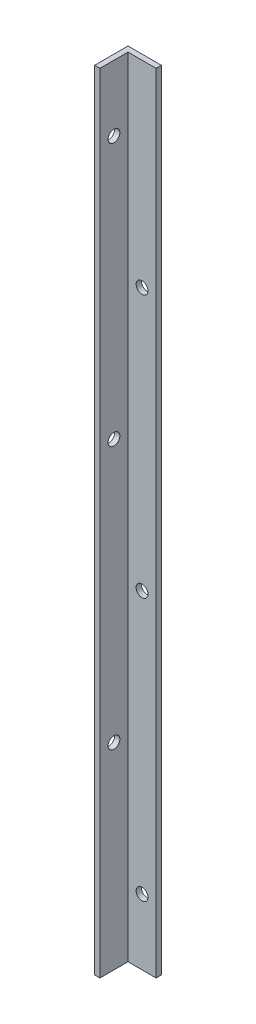
ISO-10303-21;
HEADER;
FILE_DESCRIPTION(('STEP AP214'),'2;1');
FILE_NAME('part.step','',(''),(''),'','','');
FILE_SCHEMA(('AUTOMOTIVE_DESIGN { 1 0 10303 214 1 1 1 1 }'));
ENDSEC;
DATA;
#1=APPLICATION_CONTEXT('core data for automotive mechanical design processes');
#2=APPLICATION_PROTOCOL_DEFINITION('international standard','automotive_design',2000,#1);
#3=PRODUCT_CONTEXT('',#1,'mechanical');
#4=PRODUCT('Part','Part','',(#3));
#5=PRODUCT_RELATED_PRODUCT_CATEGORY('part','',(#4));
#6=PRODUCT_DEFINITION_FORMATION('','',#4);
#7=PRODUCT_DEFINITION_CONTEXT('part definition',#1,'design');
#8=PRODUCT_DEFINITION('design','',#6,#7);
#9=PRODUCT_DEFINITION_SHAPE('','',#8);
#10=(LENGTH_UNIT() NAMED_UNIT(*) SI_UNIT(.MILLI.,.METRE.));
#11=(NAMED_UNIT(*) PLANE_ANGLE_UNIT() SI_UNIT($,.RADIAN.));
#12=(NAMED_UNIT(*) SI_UNIT($,.STERADIAN.) SOLID_ANGLE_UNIT());
#13=UNCERTAINTY_MEASURE_WITH_UNIT(LENGTH_MEASURE(1.E-05),#10,'distance_accuracy_value','');
#14=(GEOMETRIC_REPRESENTATION_CONTEXT(3) GLOBAL_UNCERTAINTY_ASSIGNED_CONTEXT((#13)) GLOBAL_UNIT_ASSIGNED_CONTEXT((#10,
#11,#12)) REPRESENTATION_CONTEXT('',''));
#15=CARTESIAN_POINT('',(0.,0.,0.));
#16=DIRECTION('',(0.,0.,1.));
#17=DIRECTION('',(1.,0.,0.));
#18=AXIS2_PLACEMENT_3D('',#15,#16,#17);
#19=CARTESIAN_POINT('',(0.,300.,0.));
#20=DIRECTION('',(0.,0.,1.));
#21=DIRECTION('',(1.,0.,0.));
#22=AXIS2_PLACEMENT_3D('',#19,#20,#21);
#23=PLANE('',#22);
#24=CARTESIAN_POINT('',(7.35000000000001,225.,0.));
#25=DIRECTION('',(0.,0.,1.));
#26=DIRECTION('',(1.,0.,0.));
#27=AXIS2_PLACEMENT_3D('',#24,#25,#26);
#28=CIRCLE('',#27,2.25);
#29=CARTESIAN_POINT('',(9.60000000000001,225.,0.));
#30=VERTEX_POINT('',#29);
#31=EDGE_CURVE('E167',#30,#30,#28,.T.);
#32=ORIENTED_EDGE('',*,*,#31,.T.);
#33=EDGE_LOOP('',(#32));
#34=FACE_BOUND('',#33,.T.);
#35=CARTESIAN_POINT('',(7.35000000000001,125.,0.));
#36=DIRECTION('',(0.,0.,1.));
#37=DIRECTION('',(1.,0.,0.));
#38=AXIS2_PLACEMENT_3D('',#35,#36,#37);
#39=CIRCLE('',#38,2.25);
#40=CARTESIAN_POINT('',(9.60000000000001,125.,0.));
#41=VERTEX_POINT('',#40);
#42=EDGE_CURVE('E171',#41,#41,#39,.T.);
#43=ORIENTED_EDGE('',*,*,#42,.T.);
#44=EDGE_LOOP('',(#43));
#45=FACE_BOUND('',#44,.T.);
#46=CARTESIAN_POINT('',(7.35000000000001,25.,0.));
#47=DIRECTION('',(0.,0.,1.));
#48=DIRECTION('',(1.,0.,0.));
#49=AXIS2_PLACEMENT_3D('',#46,#47,#48);
#50=CIRCLE('',#49,2.25);
#51=CARTESIAN_POINT('',(9.60000000000001,25.,0.));
#52=VERTEX_POINT('',#51);
#53=EDGE_CURVE('E174',#52,#52,#50,.T.);
#54=ORIENTED_EDGE('',*,*,#53,.T.);
#55=EDGE_LOOP('',(#54));
#56=FACE_BOUND('',#55,.T.);
#57=DIRECTION('',(-1.,0.,0.));
#58=VECTOR('',#57,1.);
#59=CARTESIAN_POINT('',(0.,0.,0.));
#60=LINE('',#59,#58);
#61=CARTESIAN_POINT('',(12.7,0.,0.));
#62=VERTEX_POINT('',#61);
#63=CARTESIAN_POINT('',(0.,0.,0.));
#64=VERTEX_POINT('',#63);
#65=EDGE_CURVE('E122',#62,#64,#60,.T.);
#66=ORIENTED_EDGE('',*,*,#65,.T.);
#67=DIRECTION('',(0.,-1.,0.));
#68=VECTOR('',#67,1.);
#69=CARTESIAN_POINT('',(0.,300.,0.));
#70=LINE('',#69,#68);
#71=CARTESIAN_POINT('',(0.,300.,0.));
#72=VERTEX_POINT('',#71);
#73=EDGE_CURVE('E11',#72,#64,#70,.T.);
#74=ORIENTED_EDGE('',*,*,#73,.F.);
#75=DIRECTION('',(-1.,0.,0.));
#76=VECTOR('',#75,1.);
#77=CARTESIAN_POINT('',(0.,300.,0.));
#78=LINE('',#77,#76);
#79=CARTESIAN_POINT('',(12.7,300.,0.));
#80=VERTEX_POINT('',#79);
#81=EDGE_CURVE('E133',#80,#72,#78,.T.);
#82=ORIENTED_EDGE('',*,*,#81,.F.);
#83=DIRECTION('',(0.,-1.,0.));
#84=VECTOR('',#83,1.);
#85=CARTESIAN_POINT('',(12.7,300.,0.));
#86=LINE('',#85,#84);
#87=EDGE_CURVE('E118',#80,#62,#86,.T.);
#88=ORIENTED_EDGE('',*,*,#87,.T.);
#89=EDGE_LOOP('',(#66,#74,#82,#88));
#90=FACE_BOUND('',#89,.T.);
#91=ADVANCED_FACE('F38',(#34,#45,#56,#90),#23,.F.);
#92=CARTESIAN_POINT('',(0.,300.,0.));
#93=DIRECTION('',(1.,0.,0.));
#94=DIRECTION('',(0.,0.,-1.));
#95=AXIS2_PLACEMENT_3D('',#92,#93,#94);
#96=PLANE('',#95);
#97=CARTESIAN_POINT('',(0.,275.,7.35));
#98=DIRECTION('',(1.,0.,0.));
#99=DIRECTION('',(0.,0.,-1.));
#100=AXIS2_PLACEMENT_3D('',#97,#98,#99);
#101=CIRCLE('',#100,2.25);
#102=CARTESIAN_POINT('',(0.,275.,5.09999999999999));
#103=VERTEX_POINT('',#102);
#104=EDGE_CURVE('E126',#103,#103,#101,.T.);
#105=ORIENTED_EDGE('',*,*,#104,.T.);
#106=EDGE_LOOP('',(#105));
#107=FACE_BOUND('',#106,.T.);
#108=CARTESIAN_POINT('',(0.,175.,7.35));
#109=DIRECTION('',(1.,0.,0.));
#110=DIRECTION('',(0.,0.,-1.));
#111=AXIS2_PLACEMENT_3D('',#108,#109,#110);
#112=CIRCLE('',#111,2.25);
#113=CARTESIAN_POINT('',(0.,175.,5.09999999999999));
#114=VERTEX_POINT('',#113);
#115=EDGE_CURVE('E199',#114,#114,#112,.T.);
#116=ORIENTED_EDGE('',*,*,#115,.T.);
#117=EDGE_LOOP('',(#116));
#118=FACE_BOUND('',#117,.T.);
#119=CARTESIAN_POINT('',(0.,75.,7.35));
#120=DIRECTION('',(1.,0.,0.));
#121=DIRECTION('',(0.,0.,-1.));
#122=AXIS2_PLACEMENT_3D('',#119,#120,#121);
#123=CIRCLE('',#122,2.25);
#124=CARTESIAN_POINT('',(0.,75.,5.09999999999999));
#125=VERTEX_POINT('',#124);
#126=EDGE_CURVE('E191',#125,#125,#123,.T.);
#127=ORIENTED_EDGE('',*,*,#126,.T.);
#128=EDGE_LOOP('',(#127));
#129=FACE_BOUND('',#128,.T.);
#130=DIRECTION('',(0.,0.,1.));
#131=VECTOR('',#130,1.);
#132=CARTESIAN_POINT('',(0.,0.,0.));
#133=LINE('',#132,#131);
#134=CARTESIAN_POINT('',(0.,0.,12.7));
#135=VERTEX_POINT('',#134);
#136=EDGE_CURVE('E125',#64,#135,#133,.T.);
#137=ORIENTED_EDGE('',*,*,#136,.T.);
#138=DIRECTION('',(0.,-1.,0.));
#139=VECTOR('',#138,1.);
#140=CARTESIAN_POINT('',(0.,300.,12.7));
#141=LINE('',#140,#139);
#142=CARTESIAN_POINT('',(0.,300.,12.7));
#143=VERTEX_POINT('',#142);
#144=EDGE_CURVE('E46',#143,#135,#141,.T.);
#145=ORIENTED_EDGE('',*,*,#144,.F.);
#146=DIRECTION('',(0.,0.,1.));
#147=VECTOR('',#146,1.);
#148=CARTESIAN_POINT('',(0.,300.,0.));
#149=LINE('',#148,#147);
#150=EDGE_CURVE('E91',#72,#143,#149,.T.);
#151=ORIENTED_EDGE('',*,*,#150,.F.);
#152=ORIENTED_EDGE('',*,*,#73,.T.);
#153=EDGE_LOOP('',(#137,#145,#151,#152));
#154=FACE_BOUND('',#153,.T.);
#155=ADVANCED_FACE('F158',(#107,#118,#129,#154),#96,.F.);
#156=CARTESIAN_POINT('',(0.,300.,12.7));
#157=DIRECTION('',(0.,0.,-1.));
#158=DIRECTION('',(-1.,0.,0.));
#159=AXIS2_PLACEMENT_3D('',#156,#157,#158);
#160=PLANE('',#159);
#161=DIRECTION('',(1.,0.,0.));
#162=VECTOR('',#161,1.);
#163=CARTESIAN_POINT('',(0.,0.,12.7));
#164=LINE('',#163,#162);
#165=CARTESIAN_POINT('',(2.,0.,12.7));
#166=VERTEX_POINT('',#165);
#167=EDGE_CURVE('E128',#135,#166,#164,.T.);
#168=ORIENTED_EDGE('',*,*,#167,.T.);
#169=DIRECTION('',(0.,-1.,0.));
#170=VECTOR('',#169,1.);
#171=CARTESIAN_POINT('',(2.,300.,12.7));
#172=LINE('',#171,#170);
#173=CARTESIAN_POINT('',(2.,300.,12.7));
#174=VERTEX_POINT('',#173);
#175=EDGE_CURVE('E113',#174,#166,#172,.T.);
#176=ORIENTED_EDGE('',*,*,#175,.F.);
#177=DIRECTION('',(1.,0.,0.));
#178=VECTOR('',#177,1.);
#179=CARTESIAN_POINT('',(0.,300.,12.7));
#180=LINE('',#179,#178);
#181=EDGE_CURVE('E104',#143,#174,#180,.T.);
#182=ORIENTED_EDGE('',*,*,#181,.F.);
#183=ORIENTED_EDGE('',*,*,#144,.T.);
#184=EDGE_LOOP('',(#168,#176,#182,#183));
#185=FACE_BOUND('',#184,.T.);
#186=ADVANCED_FACE('F139',(#185),#160,.F.);
#187=CARTESIAN_POINT('',(2.,300.,2.));
#188=DIRECTION('',(-1.,0.,0.));
#189=DIRECTION('',(0.,0.,1.));
#190=AXIS2_PLACEMENT_3D('',#187,#188,#189);
#191=PLANE('',#190);
#192=CARTESIAN_POINT('',(2.,275.,7.35));
#193=DIRECTION('',(1.,0.,0.));
#194=DIRECTION('',(0.,0.,-1.));
#195=AXIS2_PLACEMENT_3D('',#192,#193,#194);
#196=CIRCLE('',#195,2.25);
#197=CARTESIAN_POINT('',(2.,275.,5.09999999999999));
#198=VERTEX_POINT('',#197);
#199=EDGE_CURVE('E188',#198,#198,#196,.T.);
#200=ORIENTED_EDGE('',*,*,#199,.F.);
#201=EDGE_LOOP('',(#200));
#202=FACE_BOUND('',#201,.T.);
#203=CARTESIAN_POINT('',(2.,175.,7.35));
#204=DIRECTION('',(1.,0.,0.));
#205=DIRECTION('',(0.,0.,-1.));
#206=AXIS2_PLACEMENT_3D('',#203,#204,#205);
#207=CIRCLE('',#206,2.25);
#208=CARTESIAN_POINT('',(2.,175.,5.09999999999999));
#209=VERTEX_POINT('',#208);
#210=EDGE_CURVE('E192',#209,#209,#207,.T.);
#211=ORIENTED_EDGE('',*,*,#210,.F.);
#212=EDGE_LOOP('',(#211));
#213=FACE_BOUND('',#212,.T.);
#214=CARTESIAN_POINT('',(2.,75.,7.35));
#215=DIRECTION('',(1.,0.,0.));
#216=DIRECTION('',(0.,0.,-1.));
#217=AXIS2_PLACEMENT_3D('',#214,#215,#216);
#218=CIRCLE('',#217,2.25);
#219=CARTESIAN_POINT('',(2.,75.,5.09999999999999));
#220=VERTEX_POINT('',#219);
#221=EDGE_CURVE('E187',#220,#220,#218,.T.);
#222=ORIENTED_EDGE('',*,*,#221,.F.);
#223=EDGE_LOOP('',(#222));
#224=FACE_BOUND('',#223,.T.);
#225=DIRECTION('',(0.,0.,-1.));
#226=VECTOR('',#225,1.);
#227=CARTESIAN_POINT('',(2.,0.,2.));
#228=LINE('',#227,#226);
#229=CARTESIAN_POINT('',(2.,0.,2.));
#230=VERTEX_POINT('',#229);
#231=EDGE_CURVE('E112',#166,#230,#228,.T.);
#232=ORIENTED_EDGE('',*,*,#231,.T.);
#233=DIRECTION('',(0.,-1.,0.));
#234=VECTOR('',#233,1.);
#235=CARTESIAN_POINT('',(2.,300.,2.));
#236=LINE('',#235,#234);
#237=CARTESIAN_POINT('',(2.,300.,2.));
#238=VERTEX_POINT('',#237);
#239=EDGE_CURVE('E109',#238,#230,#236,.T.);
#240=ORIENTED_EDGE('',*,*,#239,.F.);
#241=DIRECTION('',(0.,0.,-1.));
#242=VECTOR('',#241,1.);
#243=CARTESIAN_POINT('',(2.,300.,2.));
#244=LINE('',#243,#242);
#245=EDGE_CURVE('E98',#174,#238,#244,.T.);
#246=ORIENTED_EDGE('',*,*,#245,.F.);
#247=ORIENTED_EDGE('',*,*,#175,.T.);
#248=EDGE_LOOP('',(#232,#240,#246,#247));
#249=FACE_BOUND('',#248,.T.);
#250=ADVANCED_FACE('F110',(#202,#213,#224,#249),#191,.F.);
#251=CARTESIAN_POINT('',(2.,300.,2.));
#252=DIRECTION('',(0.,0.,-1.));
#253=DIRECTION('',(-1.,0.,0.));
#254=AXIS2_PLACEMENT_3D('',#251,#252,#253);
#255=PLANE('',#254);
#256=CARTESIAN_POINT('',(7.35000000000001,225.,2.));
#257=DIRECTION('',(0.,0.,1.));
#258=DIRECTION('',(1.,0.,0.));
#259=AXIS2_PLACEMENT_3D('',#256,#257,#258);
#260=CIRCLE('',#259,2.25);
#261=CARTESIAN_POINT('',(9.60000000000001,225.,2.));
#262=VERTEX_POINT('',#261);
#263=EDGE_CURVE('E176',#262,#262,#260,.T.);
#264=ORIENTED_EDGE('',*,*,#263,.F.);
#265=EDGE_LOOP('',(#264));
#266=FACE_BOUND('',#265,.T.);
#267=CARTESIAN_POINT('',(7.35000000000001,125.,2.));
#268=DIRECTION('',(0.,0.,1.));
#269=DIRECTION('',(1.,0.,0.));
#270=AXIS2_PLACEMENT_3D('',#267,#268,#269);
#271=CIRCLE('',#270,2.25);
#272=CARTESIAN_POINT('',(9.60000000000001,125.,2.));
#273=VERTEX_POINT('',#272);
#274=EDGE_CURVE('E180',#273,#273,#271,.T.);
#275=ORIENTED_EDGE('',*,*,#274,.F.);
#276=EDGE_LOOP('',(#275));
#277=FACE_BOUND('',#276,.T.);
#278=CARTESIAN_POINT('',(7.35000000000001,25.,2.));
#279=DIRECTION('',(0.,0.,1.));
#280=DIRECTION('',(1.,0.,0.));
#281=AXIS2_PLACEMENT_3D('',#278,#279,#280);
#282=CIRCLE('',#281,2.25);
#283=CARTESIAN_POINT('',(9.60000000000001,25.,2.));
#284=VERTEX_POINT('',#283);
#285=EDGE_CURVE('E183',#284,#284,#282,.T.);
#286=ORIENTED_EDGE('',*,*,#285,.F.);
#287=EDGE_LOOP('',(#286));
#288=FACE_BOUND('',#287,.T.);
#289=DIRECTION('',(1.,0.,0.));
#290=VECTOR('',#289,1.);
#291=CARTESIAN_POINT('',(2.,0.,2.));
#292=LINE('',#291,#290);
#293=CARTESIAN_POINT('',(12.7,0.,2.));
#294=VERTEX_POINT('',#293);
#295=EDGE_CURVE('E77',#230,#294,#292,.T.);
#296=ORIENTED_EDGE('',*,*,#295,.T.);
#297=DIRECTION('',(0.,-1.,0.));
#298=VECTOR('',#297,1.);
#299=CARTESIAN_POINT('',(12.7,300.,2.));
#300=LINE('',#299,#298);
#301=CARTESIAN_POINT('',(12.7,300.,2.));
#302=VERTEX_POINT('',#301);
#303=EDGE_CURVE('E114',#302,#294,#300,.T.);
#304=ORIENTED_EDGE('',*,*,#303,.F.);
#305=DIRECTION('',(1.,0.,0.));
#306=VECTOR('',#305,1.);
#307=CARTESIAN_POINT('',(2.,300.,2.));
#308=LINE('',#307,#306);
#309=EDGE_CURVE('E102',#238,#302,#308,.T.);
#310=ORIENTED_EDGE('',*,*,#309,.F.);
#311=ORIENTED_EDGE('',*,*,#239,.T.);
#312=EDGE_LOOP('',(#296,#304,#310,#311));
#313=FACE_BOUND('',#312,.T.);
#314=ADVANCED_FACE('F116',(#266,#277,#288,#313),#255,.F.);
#315=CARTESIAN_POINT('',(12.7,300.,2.));
#316=DIRECTION('',(-1.,0.,0.));
#317=DIRECTION('',(0.,0.,1.));
#318=AXIS2_PLACEMENT_3D('',#315,#316,#317);
#319=PLANE('',#318);
#320=DIRECTION('',(0.,0.,-1.));
#321=VECTOR('',#320,1.);
#322=CARTESIAN_POINT('',(12.7,0.,2.));
#323=LINE('',#322,#321);
#324=EDGE_CURVE('E83',#294,#62,#323,.T.);
#325=ORIENTED_EDGE('',*,*,#324,.T.);
#326=ORIENTED_EDGE('',*,*,#87,.F.);
#327=DIRECTION('',(0.,0.,-1.));
#328=VECTOR('',#327,1.);
#329=CARTESIAN_POINT('',(12.7,300.,2.));
#330=LINE('',#329,#328);
#331=EDGE_CURVE('E54',#302,#80,#330,.T.);
#332=ORIENTED_EDGE('',*,*,#331,.F.);
#333=ORIENTED_EDGE('',*,*,#303,.T.);
#334=EDGE_LOOP('',(#325,#326,#332,#333));
#335=FACE_BOUND('',#334,.T.);
#336=ADVANCED_FACE('F146',(#335),#319,.F.);
#337=CARTESIAN_POINT('',(0.,300.,0.));
#338=DIRECTION('',(0.,1.,0.));
#339=DIRECTION('',(0.,0.,1.));
#340=AXIS2_PLACEMENT_3D('',#337,#338,#339);
#341=PLANE('',#340);
#342=ORIENTED_EDGE('',*,*,#81,.T.);
#343=ORIENTED_EDGE('',*,*,#150,.T.);
#344=ORIENTED_EDGE('',*,*,#181,.T.);
#345=ORIENTED_EDGE('',*,*,#245,.T.);
#346=ORIENTED_EDGE('',*,*,#309,.T.);
#347=ORIENTED_EDGE('',*,*,#331,.T.);
#348=EDGE_LOOP('',(#342,#343,#344,#345,#346,#347));
#349=FACE_BOUND('',#348,.T.);
#350=ADVANCED_FACE('F100',(#349),#341,.T.);
#351=CARTESIAN_POINT('',(0.,0.,0.));
#352=DIRECTION('',(0.,1.,0.));
#353=DIRECTION('',(0.,0.,1.));
#354=AXIS2_PLACEMENT_3D('',#351,#352,#353);
#355=PLANE('',#354);
#356=ORIENTED_EDGE('',*,*,#65,.F.);
#357=ORIENTED_EDGE('',*,*,#324,.F.);
#358=ORIENTED_EDGE('',*,*,#295,.F.);
#359=ORIENTED_EDGE('',*,*,#231,.F.);
#360=ORIENTED_EDGE('',*,*,#167,.F.);
#361=ORIENTED_EDGE('',*,*,#136,.F.);
#362=EDGE_LOOP('',(#356,#357,#358,#359,#360,#361));
#363=FACE_BOUND('',#362,.T.);
#364=ADVANCED_FACE('F142',(#363),#355,.F.);
#365=CARTESIAN_POINT('',(-8.,75.,7.35));
#366=DIRECTION('',(1.,0.,0.));
#367=DIRECTION('',(0.,0.,-1.));
#368=AXIS2_PLACEMENT_3D('',#365,#366,#367);
#369=CYLINDRICAL_SURFACE('',#368,2.25);
#370=ORIENTED_EDGE('',*,*,#221,.T.);
#371=EDGE_LOOP('',(#370));
#372=FACE_BOUND('',#371,.T.);
#373=ORIENTED_EDGE('',*,*,#126,.F.);
#374=EDGE_LOOP('',(#373));
#375=FACE_BOUND('',#374,.T.);
#376=ADVANCED_FACE('F221',(#372,#375),#369,.F.);
#377=CARTESIAN_POINT('',(-8.,175.,7.35));
#378=DIRECTION('',(1.,0.,0.));
#379=DIRECTION('',(0.,0.,-1.));
#380=AXIS2_PLACEMENT_3D('',#377,#378,#379);
#381=CYLINDRICAL_SURFACE('',#380,2.25);
#382=ORIENTED_EDGE('',*,*,#210,.T.);
#383=EDGE_LOOP('',(#382));
#384=FACE_BOUND('',#383,.T.);
#385=ORIENTED_EDGE('',*,*,#115,.F.);
#386=EDGE_LOOP('',(#385));
#387=FACE_BOUND('',#386,.T.);
#388=ADVANCED_FACE('F211',(#384,#387),#381,.F.);
#389=CARTESIAN_POINT('',(-8.,275.,7.35));
#390=DIRECTION('',(1.,0.,0.));
#391=DIRECTION('',(0.,0.,-1.));
#392=AXIS2_PLACEMENT_3D('',#389,#390,#391);
#393=CYLINDRICAL_SURFACE('',#392,2.25);
#394=ORIENTED_EDGE('',*,*,#199,.T.);
#395=EDGE_LOOP('',(#394));
#396=FACE_BOUND('',#395,.T.);
#397=ORIENTED_EDGE('',*,*,#104,.F.);
#398=EDGE_LOOP('',(#397));
#399=FACE_BOUND('',#398,.T.);
#400=ADVANCED_FACE('F208',(#396,#399),#393,.F.);
#401=CARTESIAN_POINT('',(7.35000000000001,25.,-8.));
#402=DIRECTION('',(0.,0.,1.));
#403=DIRECTION('',(1.,0.,0.));
#404=AXIS2_PLACEMENT_3D('',#401,#402,#403);
#405=CYLINDRICAL_SURFACE('',#404,2.25);
#406=ORIENTED_EDGE('',*,*,#285,.T.);
#407=EDGE_LOOP('',(#406));
#408=FACE_BOUND('',#407,.T.);
#409=ORIENTED_EDGE('',*,*,#53,.F.);
#410=EDGE_LOOP('',(#409));
#411=FACE_BOUND('',#410,.T.);
#412=ADVANCED_FACE('F210',(#408,#411),#405,.F.);
#413=CARTESIAN_POINT('',(7.35000000000001,125.,-8.));
#414=DIRECTION('',(0.,0.,1.));
#415=DIRECTION('',(1.,0.,0.));
#416=AXIS2_PLACEMENT_3D('',#413,#414,#415);
#417=CYLINDRICAL_SURFACE('',#416,2.25);
#418=ORIENTED_EDGE('',*,*,#274,.T.);
#419=EDGE_LOOP('',(#418));
#420=FACE_BOUND('',#419,.T.);
#421=ORIENTED_EDGE('',*,*,#42,.F.);
#422=EDGE_LOOP('',(#421));
#423=FACE_BOUND('',#422,.T.);
#424=ADVANCED_FACE('F218',(#420,#423),#417,.F.);
#425=CARTESIAN_POINT('',(7.35000000000001,225.,-8.));
#426=DIRECTION('',(0.,0.,1.));
#427=DIRECTION('',(1.,0.,0.));
#428=AXIS2_PLACEMENT_3D('',#425,#426,#427);
#429=CYLINDRICAL_SURFACE('',#428,2.25);
#430=ORIENTED_EDGE('',*,*,#263,.T.);
#431=EDGE_LOOP('',(#430));
#432=FACE_BOUND('',#431,.T.);
#433=ORIENTED_EDGE('',*,*,#31,.F.);
#434=EDGE_LOOP('',(#433));
#435=FACE_BOUND('',#434,.T.);
#436=ADVANCED_FACE('F281',(#432,#435),#429,.F.);
#437=CLOSED_SHELL('',(#91,#155,#186,#250,#314,#336,#350,#364,#376,#388,#400,#412,#424,#436));
#438=MANIFOLD_SOLID_BREP('B2',#437);
#439=ADVANCED_BREP_SHAPE_REPRESENTATION('',(#18,#438),#14);
#440=SHAPE_DEFINITION_REPRESENTATION(#9,#439);
ENDSEC;
END-ISO-10303-21;
